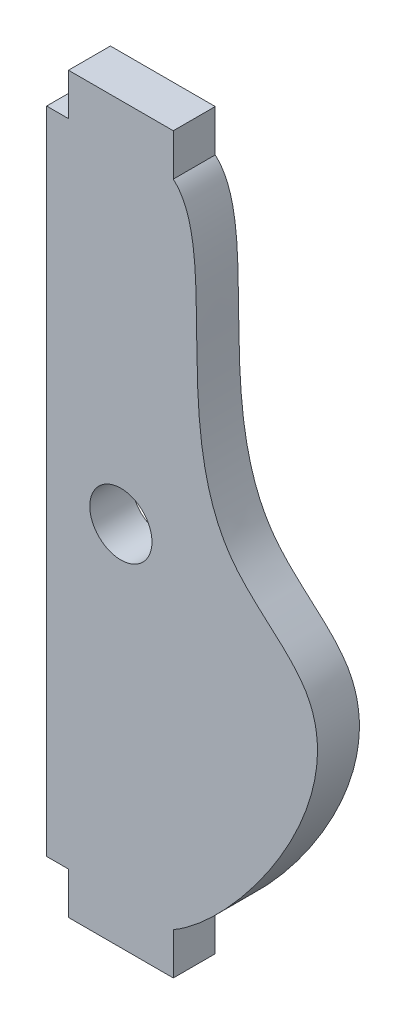
ISO-10303-21;
HEADER;
FILE_DESCRIPTION(('STEP AP214'),'2;1');
FILE_NAME('part.step','',(''),(''),'','','');
FILE_SCHEMA(('AUTOMOTIVE_DESIGN { 1 0 10303 214 1 1 1 1 }'));
ENDSEC;
DATA;
#1=APPLICATION_CONTEXT('core data for automotive mechanical design processes');
#2=APPLICATION_PROTOCOL_DEFINITION('international standard','automotive_design',2000,#1);
#3=PRODUCT_CONTEXT('',#1,'mechanical');
#4=PRODUCT('Part','Part','',(#3));
#5=PRODUCT_RELATED_PRODUCT_CATEGORY('part','',(#4));
#6=PRODUCT_DEFINITION_FORMATION('','',#4);
#7=PRODUCT_DEFINITION_CONTEXT('part definition',#1,'design');
#8=PRODUCT_DEFINITION('design','',#6,#7);
#9=PRODUCT_DEFINITION_SHAPE('','',#8);
#10=(LENGTH_UNIT() NAMED_UNIT(*) SI_UNIT(.MILLI.,.METRE.));
#11=(NAMED_UNIT(*) PLANE_ANGLE_UNIT() SI_UNIT($,.RADIAN.));
#12=(NAMED_UNIT(*) SI_UNIT($,.STERADIAN.) SOLID_ANGLE_UNIT());
#13=UNCERTAINTY_MEASURE_WITH_UNIT(LENGTH_MEASURE(1.E-05),#10,'distance_accuracy_value','');
#14=(GEOMETRIC_REPRESENTATION_CONTEXT(3) GLOBAL_UNCERTAINTY_ASSIGNED_CONTEXT((#13)) GLOBAL_UNIT_ASSIGNED_CONTEXT((#10,
#11,#12)) REPRESENTATION_CONTEXT('',''));
#15=CARTESIAN_POINT('',(0.,0.,0.));
#16=DIRECTION('',(0.,0.,1.));
#17=DIRECTION('',(1.,0.,0.));
#18=AXIS2_PLACEMENT_3D('',#15,#16,#17);
#19=CARTESIAN_POINT('',(0.,-15.5,2.));
#20=DIRECTION('',(0.,-1.,0.));
#21=DIRECTION('',(0.,0.,-1.));
#22=AXIS2_PLACEMENT_3D('',#19,#20,#21);
#23=PLANE('',#22);
#24=DIRECTION('',(-1.,0.,0.));
#25=VECTOR('',#24,1.);
#26=CARTESIAN_POINT('',(0.,-15.5,0.));
#27=LINE('',#26,#25);
#28=CARTESIAN_POINT('',(-2.5,-15.5,0.));
#29=VERTEX_POINT('',#28);
#30=CARTESIAN_POINT('',(-3.54227983300651,-15.5,0.));
#31=VERTEX_POINT('',#30);
#32=EDGE_CURVE('E156',#29,#31,#27,.T.);
#33=ORIENTED_EDGE('',*,*,#32,.F.);
#34=DIRECTION('',(0.,0.,-1.));
#35=VECTOR('',#34,1.);
#36=CARTESIAN_POINT('',(-2.5,-15.5,2.));
#37=LINE('',#36,#35);
#38=CARTESIAN_POINT('',(-2.5,-15.5,2.));
#39=VERTEX_POINT('',#38);
#40=EDGE_CURVE('E11',#39,#29,#37,.T.);
#41=ORIENTED_EDGE('',*,*,#40,.F.);
#42=DIRECTION('',(-1.,0.,0.));
#43=VECTOR('',#42,1.);
#44=CARTESIAN_POINT('',(0.,-15.5,2.));
#45=LINE('',#44,#43);
#46=CARTESIAN_POINT('',(-3.54227983300651,-15.5,2.));
#47=VERTEX_POINT('',#46);
#48=EDGE_CURVE('E200',#39,#47,#45,.T.);
#49=ORIENTED_EDGE('',*,*,#48,.T.);
#50=DIRECTION('',(0.,0.,-1.));
#51=VECTOR('',#50,1.);
#52=CARTESIAN_POINT('',(-3.54227983300651,-15.5,2.));
#53=LINE('',#52,#51);
#54=EDGE_CURVE('E58',#47,#31,#53,.T.);
#55=ORIENTED_EDGE('',*,*,#54,.T.);
#56=EDGE_LOOP('',(#33,#41,#49,#55));
#57=FACE_BOUND('',#56,.T.);
#58=ADVANCED_FACE('F41',(#57),#23,.T.);
#59=CARTESIAN_POINT('',(-2.5,0.,2.));
#60=DIRECTION('',(-1.,0.,0.));
#61=DIRECTION('',(0.,0.,1.));
#62=AXIS2_PLACEMENT_3D('',#59,#60,#61);
#63=PLANE('',#62);
#64=DIRECTION('',(0.,1.,0.));
#65=VECTOR('',#64,1.);
#66=CARTESIAN_POINT('',(-2.5,0.,0.));
#67=LINE('',#66,#65);
#68=CARTESIAN_POINT('',(-2.5,-17.5,0.));
#69=VERTEX_POINT('',#68);
#70=EDGE_CURVE('E159',#69,#29,#67,.T.);
#71=ORIENTED_EDGE('',*,*,#70,.F.);
#72=DIRECTION('',(0.,0.,-1.));
#73=VECTOR('',#72,1.);
#74=CARTESIAN_POINT('',(-2.5,-17.5,2.));
#75=LINE('',#74,#73);
#76=CARTESIAN_POINT('',(-2.5,-17.5,2.));
#77=VERTEX_POINT('',#76);
#78=EDGE_CURVE('E50',#77,#69,#75,.T.);
#79=ORIENTED_EDGE('',*,*,#78,.F.);
#80=DIRECTION('',(0.,1.,0.));
#81=VECTOR('',#80,1.);
#82=CARTESIAN_POINT('',(-2.5,0.,2.));
#83=LINE('',#82,#81);
#84=EDGE_CURVE('E235',#77,#39,#83,.T.);
#85=ORIENTED_EDGE('',*,*,#84,.T.);
#86=ORIENTED_EDGE('',*,*,#40,.T.);
#87=EDGE_LOOP('',(#71,#79,#85,#86));
#88=FACE_BOUND('',#87,.T.);
#89=ADVANCED_FACE('F234',(#88),#63,.T.);
#90=CARTESIAN_POINT('',(0.,-17.5,2.));
#91=DIRECTION('',(0.,1.,0.));
#92=DIRECTION('',(0.,0.,1.));
#93=AXIS2_PLACEMENT_3D('',#90,#91,#92);
#94=PLANE('',#93);
#95=DIRECTION('',(1.,0.,0.));
#96=VECTOR('',#95,1.);
#97=CARTESIAN_POINT('',(0.,-17.5,0.));
#98=LINE('',#97,#96);
#99=CARTESIAN_POINT('',(2.5,-17.5,0.));
#100=VERTEX_POINT('',#99);
#101=EDGE_CURVE('E163',#69,#100,#98,.T.);
#102=ORIENTED_EDGE('',*,*,#101,.T.);
#103=DIRECTION('',(0.,0.,-1.));
#104=VECTOR('',#103,1.);
#105=CARTESIAN_POINT('',(2.5,-17.5,2.));
#106=LINE('',#105,#104);
#107=CARTESIAN_POINT('',(2.5,-17.5,2.));
#108=VERTEX_POINT('',#107);
#109=EDGE_CURVE('E216',#108,#100,#106,.T.);
#110=ORIENTED_EDGE('',*,*,#109,.F.);
#111=DIRECTION('',(1.,0.,0.));
#112=VECTOR('',#111,1.);
#113=CARTESIAN_POINT('',(0.,-17.5,2.));
#114=LINE('',#113,#112);
#115=EDGE_CURVE('E225',#77,#108,#114,.T.);
#116=ORIENTED_EDGE('',*,*,#115,.F.);
#117=ORIENTED_EDGE('',*,*,#78,.T.);
#118=EDGE_LOOP('',(#102,#110,#116,#117));
#119=FACE_BOUND('',#118,.T.);
#120=ADVANCED_FACE('F223',(#119),#94,.F.);
#121=CARTESIAN_POINT('',(2.5,0.,2.));
#122=DIRECTION('',(-1.,0.,0.));
#123=DIRECTION('',(0.,0.,1.));
#124=AXIS2_PLACEMENT_3D('',#121,#122,#123);
#125=PLANE('',#124);
#126=DIRECTION('',(0.,1.,0.));
#127=VECTOR('',#126,1.);
#128=CARTESIAN_POINT('',(2.5,0.,0.));
#129=LINE('',#128,#127);
#130=CARTESIAN_POINT('',(2.5,-15.5,0.));
#131=VERTEX_POINT('',#130);
#132=EDGE_CURVE('E166',#100,#131,#129,.T.);
#133=ORIENTED_EDGE('',*,*,#132,.T.);
#134=DIRECTION('',(0.,0.,-1.));
#135=VECTOR('',#134,1.);
#136=CARTESIAN_POINT('',(2.5,-15.5,2.));
#137=LINE('',#136,#135);
#138=CARTESIAN_POINT('',(2.5,-15.5,2.));
#139=VERTEX_POINT('',#138);
#140=EDGE_CURVE('E213',#139,#131,#137,.T.);
#141=ORIENTED_EDGE('',*,*,#140,.F.);
#142=DIRECTION('',(0.,1.,0.));
#143=VECTOR('',#142,1.);
#144=CARTESIAN_POINT('',(2.5,0.,2.));
#145=LINE('',#144,#143);
#146=EDGE_CURVE('E276',#108,#139,#145,.T.);
#147=ORIENTED_EDGE('',*,*,#146,.F.);
#148=ORIENTED_EDGE('',*,*,#109,.T.);
#149=EDGE_LOOP('',(#133,#141,#147,#148));
#150=FACE_BOUND('',#149,.T.);
#151=ADVANCED_FACE('F254',(#150),#125,.F.);
#152=CARTESIAN_POINT('',(2.5,15.5,2.));
#153=CARTESIAN_POINT('',(4.77840888096019,13.4834355169304,2.));
#154=CARTESIAN_POINT('',(1.40313433464291,2.44736099264905,2.));
#155=CARTESIAN_POINT('',(13.0639816492236,-3.92279968847807,2.));
#156=CARTESIAN_POINT('',(5.48173828305553,-13.8199218018921,2.));
#157=CARTESIAN_POINT('',(2.50000000000001,-15.5,2.));
#158=B_SPLINE_CURVE_WITH_KNOTS('',3,(#152,#153,#154,#155,#156,#157),.UNSPECIFIED.,.F.,.F.,(4,1,
1,4),(0.,0.423142862627715,0.57350255627331,1.),.UNSPECIFIED.);
#159=DIRECTION('',(0.,0.,-1.));
#160=VECTOR('',#159,1.);
#161=SURFACE_OF_LINEAR_EXTRUSION('',#158,#160);
#162=CARTESIAN_POINT('',(2.5,15.5,0.));
#163=CARTESIAN_POINT('',(4.77840888096019,13.4834355169304,0.));
#164=CARTESIAN_POINT('',(1.40313433464291,2.44736099264905,0.));
#165=CARTESIAN_POINT('',(13.0639816492236,-3.92279968847807,0.));
#166=CARTESIAN_POINT('',(5.48173828305553,-13.8199218018921,0.));
#167=CARTESIAN_POINT('',(2.50000000000001,-15.5,0.));
#168=B_SPLINE_CURVE_WITH_KNOTS('',3,(#162,#163,#164,#165,#166,#167),.UNSPECIFIED.,.F.,.F.,(4,1,
1,4),(0.,0.423142862627715,0.57350255627331,1.),.UNSPECIFIED.);
#169=CARTESIAN_POINT('',(2.5,15.5,0.));
#170=VERTEX_POINT('',#169);
#171=EDGE_CURVE('E170',#170,#131,#168,.T.);
#172=ORIENTED_EDGE('',*,*,#171,.F.);
#173=DIRECTION('',(0.,0.,-1.));
#174=VECTOR('',#173,1.);
#175=CARTESIAN_POINT('',(2.5,15.5,2.));
#176=LINE('',#175,#174);
#177=CARTESIAN_POINT('',(2.5,15.5,2.));
#178=VERTEX_POINT('',#177);
#179=EDGE_CURVE('E210',#178,#170,#176,.T.);
#180=ORIENTED_EDGE('',*,*,#179,.F.);
#181=EDGE_CURVE('E267',#178,#139,#158,.T.);
#182=ORIENTED_EDGE('',*,*,#181,.T.);
#183=ORIENTED_EDGE('',*,*,#140,.T.);
#184=EDGE_LOOP('',(#172,#180,#182,#183));
#185=FACE_BOUND('',#184,.T.);
#186=ADVANCED_FACE('F259',(#185),#161,.T.);
#187=CARTESIAN_POINT('',(2.5,0.,2.));
#188=DIRECTION('',(1.,0.,0.));
#189=DIRECTION('',(0.,1.,0.));
#190=AXIS2_PLACEMENT_3D('',#187,#188,#189);
#191=PLANE('',#190);
#192=DIRECTION('',(0.,-1.,0.));
#193=VECTOR('',#192,1.);
#194=CARTESIAN_POINT('',(2.5,0.,0.));
#195=LINE('',#194,#193);
#196=CARTESIAN_POINT('',(2.5,17.5,0.));
#197=VERTEX_POINT('',#196);
#198=EDGE_CURVE('E176',#197,#170,#195,.T.);
#199=ORIENTED_EDGE('',*,*,#198,.F.);
#200=DIRECTION('',(0.,0.,-1.));
#201=VECTOR('',#200,1.);
#202=CARTESIAN_POINT('',(2.5,17.5,2.));
#203=LINE('',#202,#201);
#204=CARTESIAN_POINT('',(2.5,17.5,2.));
#205=VERTEX_POINT('',#204);
#206=EDGE_CURVE('E207',#205,#197,#203,.T.);
#207=ORIENTED_EDGE('',*,*,#206,.F.);
#208=DIRECTION('',(0.,-1.,0.));
#209=VECTOR('',#208,1.);
#210=CARTESIAN_POINT('',(2.5,0.,2.));
#211=LINE('',#210,#209);
#212=EDGE_CURVE('E275',#205,#178,#211,.T.);
#213=ORIENTED_EDGE('',*,*,#212,.T.);
#214=ORIENTED_EDGE('',*,*,#179,.T.);
#215=EDGE_LOOP('',(#199,#207,#213,#214));
#216=FACE_BOUND('',#215,.T.);
#217=ADVANCED_FACE('F264',(#216),#191,.T.);
#218=CARTESIAN_POINT('',(0.,17.5,2.));
#219=DIRECTION('',(0.,1.,0.));
#220=DIRECTION('',(0.,0.,1.));
#221=AXIS2_PLACEMENT_3D('',#218,#219,#220);
#222=PLANE('',#221);
#223=DIRECTION('',(1.,0.,0.));
#224=VECTOR('',#223,1.);
#225=CARTESIAN_POINT('',(0.,17.5,0.));
#226=LINE('',#225,#224);
#227=CARTESIAN_POINT('',(-2.5,17.5,0.));
#228=VERTEX_POINT('',#227);
#229=EDGE_CURVE('E183',#228,#197,#226,.T.);
#230=ORIENTED_EDGE('',*,*,#229,.F.);
#231=DIRECTION('',(0.,0.,-1.));
#232=VECTOR('',#231,1.);
#233=CARTESIAN_POINT('',(-2.5,17.5,2.));
#234=LINE('',#233,#232);
#235=CARTESIAN_POINT('',(-2.5,17.5,2.));
#236=VERTEX_POINT('',#235);
#237=EDGE_CURVE('E142',#236,#228,#234,.T.);
#238=ORIENTED_EDGE('',*,*,#237,.F.);
#239=DIRECTION('',(1.,0.,0.));
#240=VECTOR('',#239,1.);
#241=CARTESIAN_POINT('',(0.,17.5,2.));
#242=LINE('',#241,#240);
#243=EDGE_CURVE('E130',#236,#205,#242,.T.);
#244=ORIENTED_EDGE('',*,*,#243,.T.);
#245=ORIENTED_EDGE('',*,*,#206,.T.);
#246=EDGE_LOOP('',(#230,#238,#244,#245));
#247=FACE_BOUND('',#246,.T.);
#248=ADVANCED_FACE('F286',(#247),#222,.T.);
#249=CARTESIAN_POINT('',(-2.5,0.,2.));
#250=DIRECTION('',(1.,0.,0.));
#251=DIRECTION('',(0.,1.,0.));
#252=AXIS2_PLACEMENT_3D('',#249,#250,#251);
#253=PLANE('',#252);
#254=DIRECTION('',(0.,-1.,0.));
#255=VECTOR('',#254,1.);
#256=CARTESIAN_POINT('',(-2.5,0.,0.));
#257=LINE('',#256,#255);
#258=CARTESIAN_POINT('',(-2.5,15.5,0.));
#259=VERTEX_POINT('',#258);
#260=EDGE_CURVE('E138',#228,#259,#257,.T.);
#261=ORIENTED_EDGE('',*,*,#260,.T.);
#262=DIRECTION('',(0.,0.,-1.));
#263=VECTOR('',#262,1.);
#264=CARTESIAN_POINT('',(-2.5,15.5,2.));
#265=LINE('',#264,#263);
#266=CARTESIAN_POINT('',(-2.5,15.5,2.));
#267=VERTEX_POINT('',#266);
#268=EDGE_CURVE('E135',#267,#259,#265,.T.);
#269=ORIENTED_EDGE('',*,*,#268,.F.);
#270=DIRECTION('',(0.,-1.,0.));
#271=VECTOR('',#270,1.);
#272=CARTESIAN_POINT('',(-2.5,0.,2.));
#273=LINE('',#272,#271);
#274=EDGE_CURVE('E121',#236,#267,#273,.T.);
#275=ORIENTED_EDGE('',*,*,#274,.F.);
#276=ORIENTED_EDGE('',*,*,#237,.T.);
#277=EDGE_LOOP('',(#261,#269,#275,#276));
#278=FACE_BOUND('',#277,.T.);
#279=ADVANCED_FACE('F136',(#278),#253,.F.);
#280=CARTESIAN_POINT('',(0.,15.5,2.));
#281=DIRECTION('',(0.,1.,0.));
#282=DIRECTION('',(0.,0.,1.));
#283=AXIS2_PLACEMENT_3D('',#280,#281,#282);
#284=PLANE('',#283);
#285=DIRECTION('',(1.,0.,0.));
#286=VECTOR('',#285,1.);
#287=CARTESIAN_POINT('',(0.,15.5,0.));
#288=LINE('',#287,#286);
#289=CARTESIAN_POINT('',(-3.54227983300651,15.5,0.));
#290=VERTEX_POINT('',#289);
#291=EDGE_CURVE('E189',#290,#259,#288,.T.);
#292=ORIENTED_EDGE('',*,*,#291,.F.);
#293=DIRECTION('',(0.,0.,-1.));
#294=VECTOR('',#293,1.);
#295=CARTESIAN_POINT('',(-3.54227983300651,15.5,2.));
#296=LINE('',#295,#294);
#297=CARTESIAN_POINT('',(-3.54227983300651,15.5,2.));
#298=VERTEX_POINT('',#297);
#299=EDGE_CURVE('E89',#298,#290,#296,.T.);
#300=ORIENTED_EDGE('',*,*,#299,.F.);
#301=DIRECTION('',(1.,0.,0.));
#302=VECTOR('',#301,1.);
#303=CARTESIAN_POINT('',(0.,15.5,2.));
#304=LINE('',#303,#302);
#305=EDGE_CURVE('E127',#298,#267,#304,.T.);
#306=ORIENTED_EDGE('',*,*,#305,.T.);
#307=ORIENTED_EDGE('',*,*,#268,.T.);
#308=EDGE_LOOP('',(#292,#300,#306,#307));
#309=FACE_BOUND('',#308,.T.);
#310=ADVANCED_FACE('F144',(#309),#284,.T.);
#311=CARTESIAN_POINT('',(-3.54227983300651,0.,2.));
#312=DIRECTION('',(-1.,0.,0.));
#313=DIRECTION('',(0.,0.,1.));
#314=AXIS2_PLACEMENT_3D('',#311,#312,#313);
#315=PLANE('',#314);
#316=DIRECTION('',(0.,1.,0.));
#317=VECTOR('',#316,1.);
#318=CARTESIAN_POINT('',(-3.54227983300651,0.,0.));
#319=LINE('',#318,#317);
#320=EDGE_CURVE('E192',#31,#290,#319,.T.);
#321=ORIENTED_EDGE('',*,*,#320,.F.);
#322=ORIENTED_EDGE('',*,*,#54,.F.);
#323=DIRECTION('',(0.,1.,0.));
#324=VECTOR('',#323,1.);
#325=CARTESIAN_POINT('',(-3.54227983300651,0.,2.));
#326=LINE('',#325,#324);
#327=EDGE_CURVE('E146',#47,#298,#326,.T.);
#328=ORIENTED_EDGE('',*,*,#327,.T.);
#329=ORIENTED_EDGE('',*,*,#299,.T.);
#330=EDGE_LOOP('',(#321,#322,#328,#329));
#331=FACE_BOUND('',#330,.T.);
#332=ADVANCED_FACE('F236',(#331),#315,.T.);
#333=CARTESIAN_POINT('',(0.,0.,2.));
#334=DIRECTION('',(0.,0.,-1.));
#335=DIRECTION('',(-1.,0.,0.));
#336=AXIS2_PLACEMENT_3D('',#333,#334,#335);
#337=CYLINDRICAL_SURFACE('',#336,1.48280389026004);
#338=CARTESIAN_POINT('',(0.,0.,2.));
#339=DIRECTION('',(0.,0.,1.));
#340=DIRECTION('',(1.,0.,0.));
#341=AXIS2_PLACEMENT_3D('',#338,#339,#340);
#342=CIRCLE('',#341,1.48280389026004);
#343=CARTESIAN_POINT('',(1.48280389026004,0.,2.));
#344=VERTEX_POINT('',#343);
#345=EDGE_CURVE('E149',#344,#344,#342,.T.);
#346=ORIENTED_EDGE('',*,*,#345,.T.);
#347=EDGE_LOOP('',(#346));
#348=FACE_BOUND('',#347,.T.);
#349=CARTESIAN_POINT('',(0.,0.,0.));
#350=DIRECTION('',(0.,0.,1.));
#351=DIRECTION('',(1.,0.,0.));
#352=AXIS2_PLACEMENT_3D('',#349,#350,#351);
#353=CIRCLE('',#352,1.48280389026004);
#354=CARTESIAN_POINT('',(1.48280389026004,0.,0.));
#355=VERTEX_POINT('',#354);
#356=EDGE_CURVE('E196',#355,#355,#353,.T.);
#357=ORIENTED_EDGE('',*,*,#356,.F.);
#358=EDGE_LOOP('',(#357));
#359=FACE_BOUND('',#358,.T.);
#360=ADVANCED_FACE('F238',(#348,#359),#337,.F.);
#361=CARTESIAN_POINT('',(0.,0.,2.));
#362=DIRECTION('',(0.,0.,1.));
#363=DIRECTION('',(1.,0.,0.));
#364=AXIS2_PLACEMENT_3D('',#361,#362,#363);
#365=PLANE('',#364);
#366=ORIENTED_EDGE('',*,*,#48,.F.);
#367=ORIENTED_EDGE('',*,*,#84,.F.);
#368=ORIENTED_EDGE('',*,*,#115,.T.);
#369=ORIENTED_EDGE('',*,*,#146,.T.);
#370=ORIENTED_EDGE('',*,*,#181,.F.);
#371=ORIENTED_EDGE('',*,*,#212,.F.);
#372=ORIENTED_EDGE('',*,*,#243,.F.);
#373=ORIENTED_EDGE('',*,*,#274,.T.);
#374=ORIENTED_EDGE('',*,*,#305,.F.);
#375=ORIENTED_EDGE('',*,*,#327,.F.);
#376=EDGE_LOOP('',(#366,#367,#368,#369,#370,#371,#372,#373,#374,#375));
#377=FACE_BOUND('',#376,.T.);
#378=ORIENTED_EDGE('',*,*,#345,.F.);
#379=EDGE_LOOP('',(#378));
#380=FACE_BOUND('',#379,.T.);
#381=ADVANCED_FACE('F123',(#377,#380),#365,.T.);
#382=CARTESIAN_POINT('',(0.,0.,0.));
#383=DIRECTION('',(0.,0.,1.));
#384=DIRECTION('',(1.,0.,0.));
#385=AXIS2_PLACEMENT_3D('',#382,#383,#384);
#386=PLANE('',#385);
#387=ORIENTED_EDGE('',*,*,#32,.T.);
#388=ORIENTED_EDGE('',*,*,#320,.T.);
#389=ORIENTED_EDGE('',*,*,#291,.T.);
#390=ORIENTED_EDGE('',*,*,#260,.F.);
#391=ORIENTED_EDGE('',*,*,#229,.T.);
#392=ORIENTED_EDGE('',*,*,#198,.T.);
#393=ORIENTED_EDGE('',*,*,#171,.T.);
#394=ORIENTED_EDGE('',*,*,#132,.F.);
#395=ORIENTED_EDGE('',*,*,#101,.F.);
#396=ORIENTED_EDGE('',*,*,#70,.T.);
#397=EDGE_LOOP('',(#387,#388,#389,#390,#391,#392,#393,#394,#395,#396));
#398=FACE_BOUND('',#397,.T.);
#399=ORIENTED_EDGE('',*,*,#356,.T.);
#400=EDGE_LOOP('',(#399));
#401=FACE_BOUND('',#400,.T.);
#402=ADVANCED_FACE('F232',(#398,#401),#386,.F.);
#403=CLOSED_SHELL('',(#58,#89,#120,#151,#186,#217,#248,#279,#310,#332,#360,#381,#402));
#404=MANIFOLD_SOLID_BREP('B2',#403);
#405=ADVANCED_BREP_SHAPE_REPRESENTATION('',(#18,#404),#14);
#406=SHAPE_DEFINITION_REPRESENTATION(#9,#405);
ENDSEC;
END-ISO-10303-21;
